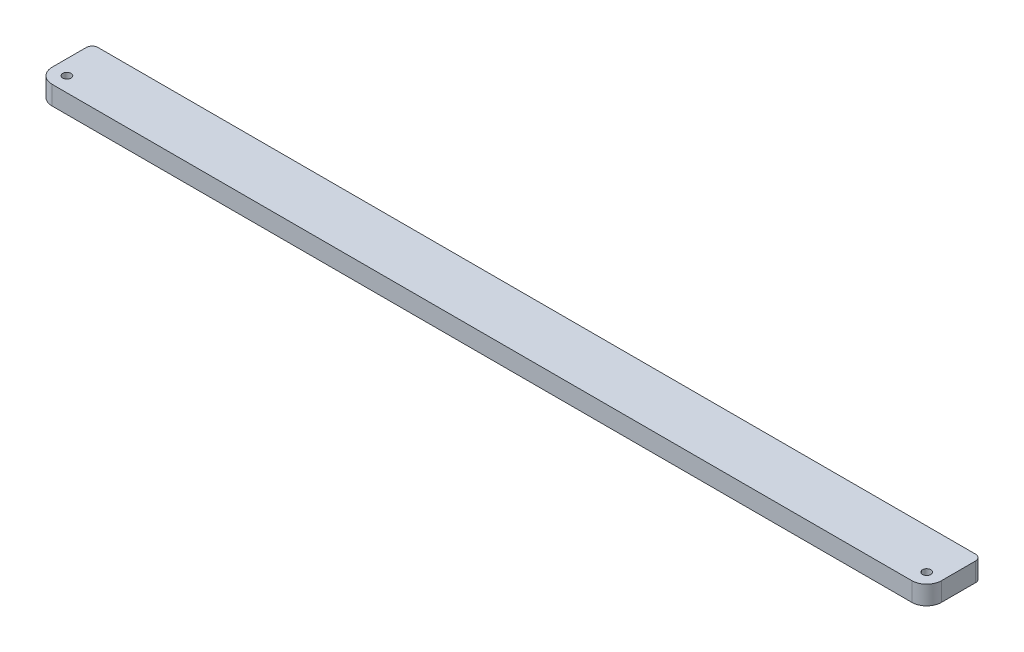
ISO-10303-21;
HEADER;
FILE_DESCRIPTION(('STEP AP214'),'2;1');
FILE_NAME('part.step','',(''),(''),'','','');
FILE_SCHEMA(('AUTOMOTIVE_DESIGN { 1 0 10303 214 1 1 1 1 }'));
ENDSEC;
DATA;
#1=APPLICATION_CONTEXT('core data for automotive mechanical design processes');
#2=APPLICATION_PROTOCOL_DEFINITION('international standard','automotive_design',2000,#1);
#3=PRODUCT_CONTEXT('',#1,'mechanical');
#4=PRODUCT('Part','Part','',(#3));
#5=PRODUCT_RELATED_PRODUCT_CATEGORY('part','',(#4));
#6=PRODUCT_DEFINITION_FORMATION('','',#4);
#7=PRODUCT_DEFINITION_CONTEXT('part definition',#1,'design');
#8=PRODUCT_DEFINITION('design','',#6,#7);
#9=PRODUCT_DEFINITION_SHAPE('','',#8);
#10=(LENGTH_UNIT() NAMED_UNIT(*) SI_UNIT(.MILLI.,.METRE.));
#11=(NAMED_UNIT(*) PLANE_ANGLE_UNIT() SI_UNIT($,.RADIAN.));
#12=(NAMED_UNIT(*) SI_UNIT($,.STERADIAN.) SOLID_ANGLE_UNIT());
#13=UNCERTAINTY_MEASURE_WITH_UNIT(LENGTH_MEASURE(1.E-05),#10,'distance_accuracy_value','');
#14=(GEOMETRIC_REPRESENTATION_CONTEXT(3) GLOBAL_UNCERTAINTY_ASSIGNED_CONTEXT((#13)) GLOBAL_UNIT_ASSIGNED_CONTEXT((#10,
#11,#12)) REPRESENTATION_CONTEXT('',''));
#15=CARTESIAN_POINT('',(0.,0.,0.));
#16=DIRECTION('',(0.,0.,1.));
#17=DIRECTION('',(1.,0.,0.));
#18=AXIS2_PLACEMENT_3D('',#15,#16,#17);
#19=CARTESIAN_POINT('',(-150.,6.35,9.25000000000002));
#20=DIRECTION('',(1.,0.,0.));
#21=DIRECTION('',(0.,0.,-1.));
#22=AXIS2_PLACEMENT_3D('',#19,#20,#21);
#23=PLANE('',#22);
#24=DIRECTION('',(0.,0.,1.));
#25=VECTOR('',#24,1.);
#26=CARTESIAN_POINT('',(-150.,6.35,9.25000000000002));
#27=LINE('',#26,#25);
#28=CARTESIAN_POINT('',(-150.,6.35,-7.24999999999998));
#29=VERTEX_POINT('',#28);
#30=CARTESIAN_POINT('',(-150.,6.35,4.25000000000002));
#31=VERTEX_POINT('',#30);
#32=EDGE_CURVE('E126',#29,#31,#27,.T.);
#33=ORIENTED_EDGE('',*,*,#32,.F.);
#34=DIRECTION('',(0.,-1.,0.));
#35=VECTOR('',#34,1.);
#36=CARTESIAN_POINT('',(-150.,6.35,-7.24999999999998));
#37=LINE('',#36,#35);
#38=CARTESIAN_POINT('',(-150.,0.,-7.24999999999998));
#39=VERTEX_POINT('',#38);
#40=EDGE_CURVE('E152',#29,#39,#37,.T.);
#41=ORIENTED_EDGE('',*,*,#40,.T.);
#42=DIRECTION('',(0.,0.,1.));
#43=VECTOR('',#42,1.);
#44=CARTESIAN_POINT('',(-150.,0.,9.25000000000002));
#45=LINE('',#44,#43);
#46=CARTESIAN_POINT('',(-150.,0.,4.25000000000002));
#47=VERTEX_POINT('',#46);
#48=EDGE_CURVE('E160',#39,#47,#45,.T.);
#49=ORIENTED_EDGE('',*,*,#48,.T.);
#50=DIRECTION('',(0.,-1.,0.));
#51=VECTOR('',#50,1.);
#52=CARTESIAN_POINT('',(-150.,6.35,4.25000000000002));
#53=LINE('',#52,#51);
#54=EDGE_CURVE('E150',#47,#31,#53,.F.);
#55=ORIENTED_EDGE('',*,*,#54,.T.);
#56=EDGE_LOOP('',(#33,#41,#49,#55));
#57=FACE_BOUND('',#56,.T.);
#58=ADVANCED_FACE('F35',(#57),#23,.F.);
#59=CARTESIAN_POINT('',(150.,6.35,9.24999999999998));
#60=DIRECTION('',(0.,0.,-1.));
#61=DIRECTION('',(-1.,0.,0.));
#62=AXIS2_PLACEMENT_3D('',#59,#60,#61);
#63=PLANE('',#62);
#64=DIRECTION('',(1.,0.,0.));
#65=VECTOR('',#64,1.);
#66=CARTESIAN_POINT('',(150.,0.,9.24999999999998));
#67=LINE('',#66,#65);
#68=CARTESIAN_POINT('',(-145.,0.,9.25000000000002));
#69=VERTEX_POINT('',#68);
#70=CARTESIAN_POINT('',(145.,0.,9.24999999999998));
#71=VERTEX_POINT('',#70);
#72=EDGE_CURVE('E131',#69,#71,#67,.T.);
#73=ORIENTED_EDGE('',*,*,#72,.T.);
#74=DIRECTION('',(0.,-1.,0.));
#75=VECTOR('',#74,1.);
#76=CARTESIAN_POINT('',(145.,6.35,9.24999999999998));
#77=LINE('',#76,#75);
#78=CARTESIAN_POINT('',(145.,6.35,9.24999999999998));
#79=VERTEX_POINT('',#78);
#80=EDGE_CURVE('E12',#71,#79,#77,.F.);
#81=ORIENTED_EDGE('',*,*,#80,.T.);
#82=DIRECTION('',(1.,0.,0.));
#83=VECTOR('',#82,1.);
#84=CARTESIAN_POINT('',(150.,6.35,9.24999999999998));
#85=LINE('',#84,#83);
#86=CARTESIAN_POINT('',(-145.,6.35,9.25000000000002));
#87=VERTEX_POINT('',#86);
#88=EDGE_CURVE('E129',#87,#79,#85,.T.);
#89=ORIENTED_EDGE('',*,*,#88,.F.);
#90=DIRECTION('',(0.,-1.,0.));
#91=VECTOR('',#90,1.);
#92=CARTESIAN_POINT('',(-145.,6.35,9.25000000000002));
#93=LINE('',#92,#91);
#94=EDGE_CURVE('E43',#87,#69,#93,.T.);
#95=ORIENTED_EDGE('',*,*,#94,.T.);
#96=EDGE_LOOP('',(#73,#81,#89,#95));
#97=FACE_BOUND('',#96,.T.);
#98=ADVANCED_FACE('F157',(#97),#63,.F.);
#99=CARTESIAN_POINT('',(150.,6.35,9.24999999999998));
#100=DIRECTION('',(-1.,0.,0.));
#101=DIRECTION('',(0.,0.,1.));
#102=AXIS2_PLACEMENT_3D('',#99,#100,#101);
#103=PLANE('',#102);
#104=DIRECTION('',(0.,0.,-1.));
#105=VECTOR('',#104,1.);
#106=CARTESIAN_POINT('',(150.,0.,9.24999999999998));
#107=LINE('',#106,#105);
#108=CARTESIAN_POINT('',(150.,0.,4.24999999999998));
#109=VERTEX_POINT('',#108);
#110=CARTESIAN_POINT('',(150.,0.,-7.25000000000002));
#111=VERTEX_POINT('',#110);
#112=EDGE_CURVE('E127',#109,#111,#107,.T.);
#113=ORIENTED_EDGE('',*,*,#112,.T.);
#114=DIRECTION('',(0.,-1.,0.));
#115=VECTOR('',#114,1.);
#116=CARTESIAN_POINT('',(150.,6.35,-7.25000000000002));
#117=LINE('',#116,#115);
#118=CARTESIAN_POINT('',(150.,6.35,-7.25000000000002));
#119=VERTEX_POINT('',#118);
#120=EDGE_CURVE('E105',#111,#119,#117,.F.);
#121=ORIENTED_EDGE('',*,*,#120,.T.);
#122=DIRECTION('',(0.,0.,-1.));
#123=VECTOR('',#122,1.);
#124=CARTESIAN_POINT('',(150.,6.35,9.24999999999998));
#125=LINE('',#124,#123);
#126=CARTESIAN_POINT('',(150.,6.35,4.24999999999998));
#127=VERTEX_POINT('',#126);
#128=EDGE_CURVE('E165',#127,#119,#125,.T.);
#129=ORIENTED_EDGE('',*,*,#128,.F.);
#130=DIRECTION('',(0.,-1.,0.));
#131=VECTOR('',#130,1.);
#132=CARTESIAN_POINT('',(150.,6.35,4.24999999999998));
#133=LINE('',#132,#131);
#134=EDGE_CURVE('E110',#127,#109,#133,.T.);
#135=ORIENTED_EDGE('',*,*,#134,.T.);
#136=EDGE_LOOP('',(#113,#121,#129,#135));
#137=FACE_BOUND('',#136,.T.);
#138=ADVANCED_FACE('F199',(#137),#103,.F.);
#139=CARTESIAN_POINT('',(150.,6.35,-9.25000000000002));
#140=DIRECTION('',(0.,0.,1.));
#141=DIRECTION('',(1.,0.,0.));
#142=AXIS2_PLACEMENT_3D('',#139,#140,#141);
#143=PLANE('',#142);
#144=DIRECTION('',(-1.,0.,0.));
#145=VECTOR('',#144,1.);
#146=CARTESIAN_POINT('',(150.,6.35,-9.25000000000002));
#147=LINE('',#146,#145);
#148=CARTESIAN_POINT('',(148.,6.35,-9.25000000000002));
#149=VERTEX_POINT('',#148);
#150=CARTESIAN_POINT('',(-148.,6.35,-9.24999999999998));
#151=VERTEX_POINT('',#150);
#152=EDGE_CURVE('E120',#149,#151,#147,.T.);
#153=ORIENTED_EDGE('',*,*,#152,.F.);
#154=DIRECTION('',(0.,-1.,0.));
#155=VECTOR('',#154,1.);
#156=CARTESIAN_POINT('',(148.,6.35,-9.25000000000002));
#157=LINE('',#156,#155);
#158=CARTESIAN_POINT('',(148.,0.,-9.25000000000002));
#159=VERTEX_POINT('',#158);
#160=EDGE_CURVE('E104',#149,#159,#157,.T.);
#161=ORIENTED_EDGE('',*,*,#160,.T.);
#162=DIRECTION('',(-1.,0.,0.));
#163=VECTOR('',#162,1.);
#164=CARTESIAN_POINT('',(150.,0.,-9.25000000000002));
#165=LINE('',#164,#163);
#166=CARTESIAN_POINT('',(-148.,0.,-9.24999999999998));
#167=VERTEX_POINT('',#166);
#168=EDGE_CURVE('E117',#159,#167,#165,.T.);
#169=ORIENTED_EDGE('',*,*,#168,.T.);
#170=DIRECTION('',(0.,-1.,0.));
#171=VECTOR('',#170,1.);
#172=CARTESIAN_POINT('',(-148.,6.35,-9.24999999999998));
#173=LINE('',#172,#171);
#174=EDGE_CURVE('E122',#167,#151,#173,.F.);
#175=ORIENTED_EDGE('',*,*,#174,.T.);
#176=EDGE_LOOP('',(#153,#161,#169,#175));
#177=FACE_BOUND('',#176,.T.);
#178=ADVANCED_FACE('F116',(#177),#143,.F.);
#179=CARTESIAN_POINT('',(0.,6.35,0.));
#180=DIRECTION('',(0.,1.,0.));
#181=DIRECTION('',(0.,0.,1.));
#182=AXIS2_PLACEMENT_3D('',#179,#180,#181);
#183=PLANE('',#182);
#184=CARTESIAN_POINT('',(145.,6.35,4.24999999999998));
#185=DIRECTION('',(0.,1.,0.));
#186=DIRECTION('',(0.,0.,1.));
#187=AXIS2_PLACEMENT_3D('',#184,#185,#186);
#188=CIRCLE('',#187,1.4);
#189=CARTESIAN_POINT('',(145.,6.35,5.64999999999999));
#190=VERTEX_POINT('',#189);
#191=EDGE_CURVE('E175',#190,#190,#188,.T.);
#192=ORIENTED_EDGE('',*,*,#191,.F.);
#193=EDGE_LOOP('',(#192));
#194=FACE_BOUND('',#193,.T.);
#195=CARTESIAN_POINT('',(-145.,6.35,4.25000000000002));
#196=DIRECTION('',(0.,1.,0.));
#197=DIRECTION('',(0.,0.,1.));
#198=AXIS2_PLACEMENT_3D('',#195,#196,#197);
#199=CIRCLE('',#198,1.4);
#200=CARTESIAN_POINT('',(-145.,6.35,5.65000000000002));
#201=VERTEX_POINT('',#200);
#202=EDGE_CURVE('E169',#201,#201,#199,.T.);
#203=ORIENTED_EDGE('',*,*,#202,.F.);
#204=EDGE_LOOP('',(#203));
#205=FACE_BOUND('',#204,.T.);
#206=ORIENTED_EDGE('',*,*,#128,.T.);
#207=CARTESIAN_POINT('',(148.,6.35,-7.25000000000002));
#208=DIRECTION('',(0.,1.,0.));
#209=DIRECTION('',(0.,0.,1.));
#210=AXIS2_PLACEMENT_3D('',#207,#208,#209);
#211=CIRCLE('',#210,2.);
#212=EDGE_CURVE('E148',#119,#149,#211,.T.);
#213=ORIENTED_EDGE('',*,*,#212,.T.);
#214=ORIENTED_EDGE('',*,*,#152,.T.);
#215=CARTESIAN_POINT('',(-148.,6.35,-7.24999999999998));
#216=DIRECTION('',(0.,1.,0.));
#217=DIRECTION('',(0.,0.,1.));
#218=AXIS2_PLACEMENT_3D('',#215,#216,#217);
#219=CIRCLE('',#218,2.);
#220=EDGE_CURVE('E146',#151,#29,#219,.T.);
#221=ORIENTED_EDGE('',*,*,#220,.T.);
#222=ORIENTED_EDGE('',*,*,#32,.T.);
#223=CARTESIAN_POINT('',(-145.,6.35,4.25000000000002));
#224=DIRECTION('',(0.,1.,0.));
#225=DIRECTION('',(0.,0.,1.));
#226=AXIS2_PLACEMENT_3D('',#223,#224,#225);
#227=CIRCLE('',#226,5.);
#228=EDGE_CURVE('E55',#31,#87,#227,.T.);
#229=ORIENTED_EDGE('',*,*,#228,.T.);
#230=ORIENTED_EDGE('',*,*,#88,.T.);
#231=CARTESIAN_POINT('',(145.,6.35,4.24999999999998));
#232=DIRECTION('',(0.,1.,0.));
#233=DIRECTION('',(0.,0.,1.));
#234=AXIS2_PLACEMENT_3D('',#231,#232,#233);
#235=CIRCLE('',#234,5.);
#236=EDGE_CURVE('E144',#79,#127,#235,.T.);
#237=ORIENTED_EDGE('',*,*,#236,.T.);
#238=EDGE_LOOP('',(#206,#213,#214,#221,#222,#229,#230,#237));
#239=FACE_BOUND('',#238,.T.);
#240=ADVANCED_FACE('F190',(#194,#205,#239),#183,.T.);
#241=CARTESIAN_POINT('',(0.,0.,0.));
#242=DIRECTION('',(0.,1.,0.));
#243=DIRECTION('',(0.,0.,1.));
#244=AXIS2_PLACEMENT_3D('',#241,#242,#243);
#245=PLANE('',#244);
#246=CARTESIAN_POINT('',(145.,0.,4.24999999999998));
#247=DIRECTION('',(0.,1.,0.));
#248=DIRECTION('',(0.,0.,1.));
#249=AXIS2_PLACEMENT_3D('',#246,#247,#248);
#250=CIRCLE('',#249,1.4);
#251=CARTESIAN_POINT('',(145.,0.,5.64999999999999));
#252=VERTEX_POINT('',#251);
#253=EDGE_CURVE('E172',#252,#252,#250,.T.);
#254=ORIENTED_EDGE('',*,*,#253,.T.);
#255=EDGE_LOOP('',(#254));
#256=FACE_BOUND('',#255,.T.);
#257=CARTESIAN_POINT('',(-145.,0.,4.25000000000002));
#258=DIRECTION('',(0.,1.,0.));
#259=DIRECTION('',(0.,0.,1.));
#260=AXIS2_PLACEMENT_3D('',#257,#258,#259);
#261=CIRCLE('',#260,1.4);
#262=CARTESIAN_POINT('',(-145.,0.,5.65000000000002));
#263=VERTEX_POINT('',#262);
#264=EDGE_CURVE('E161',#263,#263,#261,.T.);
#265=ORIENTED_EDGE('',*,*,#264,.T.);
#266=EDGE_LOOP('',(#265));
#267=FACE_BOUND('',#266,.T.);
#268=ORIENTED_EDGE('',*,*,#168,.F.);
#269=CARTESIAN_POINT('',(148.,0.,-7.25000000000002));
#270=DIRECTION('',(0.,1.,0.));
#271=DIRECTION('',(0.,0.,1.));
#272=AXIS2_PLACEMENT_3D('',#269,#270,#271);
#273=CIRCLE('',#272,2.);
#274=EDGE_CURVE('E100',#159,#111,#273,.F.);
#275=ORIENTED_EDGE('',*,*,#274,.T.);
#276=ORIENTED_EDGE('',*,*,#112,.F.);
#277=CARTESIAN_POINT('',(145.,0.,4.24999999999998));
#278=DIRECTION('',(0.,1.,0.));
#279=DIRECTION('',(0.,0.,1.));
#280=AXIS2_PLACEMENT_3D('',#277,#278,#279);
#281=CIRCLE('',#280,5.);
#282=EDGE_CURVE('E137',#109,#71,#281,.F.);
#283=ORIENTED_EDGE('',*,*,#282,.T.);
#284=ORIENTED_EDGE('',*,*,#72,.F.);
#285=CARTESIAN_POINT('',(-145.,0.,4.25000000000002));
#286=DIRECTION('',(0.,1.,0.));
#287=DIRECTION('',(0.,0.,1.));
#288=AXIS2_PLACEMENT_3D('',#285,#286,#287);
#289=CIRCLE('',#288,5.);
#290=EDGE_CURVE('E121',#69,#47,#289,.F.);
#291=ORIENTED_EDGE('',*,*,#290,.T.);
#292=ORIENTED_EDGE('',*,*,#48,.F.);
#293=CARTESIAN_POINT('',(-148.,0.,-7.24999999999998));
#294=DIRECTION('',(0.,1.,0.));
#295=DIRECTION('',(0.,0.,1.));
#296=AXIS2_PLACEMENT_3D('',#293,#294,#295);
#297=CIRCLE('',#296,2.);
#298=EDGE_CURVE('E111',#39,#167,#297,.F.);
#299=ORIENTED_EDGE('',*,*,#298,.T.);
#300=EDGE_LOOP('',(#268,#275,#276,#283,#284,#291,#292,#299));
#301=FACE_BOUND('',#300,.T.);
#302=ADVANCED_FACE('F124',(#256,#267,#301),#245,.F.);
#303=CARTESIAN_POINT('',(148.,6.35,-7.25000000000002));
#304=DIRECTION('',(0.,-1.,0.));
#305=DIRECTION('',(0.,0.,-1.));
#306=AXIS2_PLACEMENT_3D('',#303,#304,#305);
#307=CYLINDRICAL_SURFACE('',#306,2.);
#308=ORIENTED_EDGE('',*,*,#212,.F.);
#309=ORIENTED_EDGE('',*,*,#120,.F.);
#310=ORIENTED_EDGE('',*,*,#274,.F.);
#311=ORIENTED_EDGE('',*,*,#160,.F.);
#312=EDGE_LOOP('',(#308,#309,#310,#311));
#313=FACE_BOUND('',#312,.T.);
#314=ADVANCED_FACE('F103',(#313),#307,.T.);
#315=CARTESIAN_POINT('',(-148.,6.35,-7.24999999999998));
#316=DIRECTION('',(0.,-1.,0.));
#317=DIRECTION('',(0.,0.,-1.));
#318=AXIS2_PLACEMENT_3D('',#315,#316,#317);
#319=CYLINDRICAL_SURFACE('',#318,2.);
#320=ORIENTED_EDGE('',*,*,#220,.F.);
#321=ORIENTED_EDGE('',*,*,#174,.F.);
#322=ORIENTED_EDGE('',*,*,#298,.F.);
#323=ORIENTED_EDGE('',*,*,#40,.F.);
#324=EDGE_LOOP('',(#320,#321,#322,#323));
#325=FACE_BOUND('',#324,.T.);
#326=ADVANCED_FACE('F203',(#325),#319,.T.);
#327=CARTESIAN_POINT('',(145.,6.35,4.24999999999998));
#328=DIRECTION('',(0.,-1.,0.));
#329=DIRECTION('',(0.,0.,-1.));
#330=AXIS2_PLACEMENT_3D('',#327,#328,#329);
#331=CYLINDRICAL_SURFACE('',#330,5.);
#332=ORIENTED_EDGE('',*,*,#236,.F.);
#333=ORIENTED_EDGE('',*,*,#80,.F.);
#334=ORIENTED_EDGE('',*,*,#282,.F.);
#335=ORIENTED_EDGE('',*,*,#134,.F.);
#336=EDGE_LOOP('',(#332,#333,#334,#335));
#337=FACE_BOUND('',#336,.T.);
#338=ADVANCED_FACE('F201',(#337),#331,.T.);
#339=CARTESIAN_POINT('',(-145.,6.35,4.25000000000002));
#340=DIRECTION('',(0.,-1.,0.));
#341=DIRECTION('',(0.,0.,-1.));
#342=AXIS2_PLACEMENT_3D('',#339,#340,#341);
#343=CYLINDRICAL_SURFACE('',#342,5.);
#344=ORIENTED_EDGE('',*,*,#228,.F.);
#345=ORIENTED_EDGE('',*,*,#54,.F.);
#346=ORIENTED_EDGE('',*,*,#290,.F.);
#347=ORIENTED_EDGE('',*,*,#94,.F.);
#348=EDGE_LOOP('',(#344,#345,#346,#347));
#349=FACE_BOUND('',#348,.T.);
#350=ADVANCED_FACE('F37',(#349),#343,.T.);
#351=CARTESIAN_POINT('',(-145.,0.,4.25000000000002));
#352=DIRECTION('',(0.,1.,0.));
#353=DIRECTION('',(0.,0.,1.));
#354=AXIS2_PLACEMENT_3D('',#351,#352,#353);
#355=CYLINDRICAL_SURFACE('',#354,1.4);
#356=ORIENTED_EDGE('',*,*,#264,.F.);
#357=EDGE_LOOP('',(#356));
#358=FACE_BOUND('',#357,.T.);
#359=ORIENTED_EDGE('',*,*,#202,.T.);
#360=EDGE_LOOP('',(#359));
#361=FACE_BOUND('',#360,.T.);
#362=ADVANCED_FACE('F186',(#358,#361),#355,.F.);
#363=CARTESIAN_POINT('',(145.,0.,4.24999999999998));
#364=DIRECTION('',(0.,1.,0.));
#365=DIRECTION('',(0.,0.,1.));
#366=AXIS2_PLACEMENT_3D('',#363,#364,#365);
#367=CYLINDRICAL_SURFACE('',#366,1.4);
#368=ORIENTED_EDGE('',*,*,#253,.F.);
#369=EDGE_LOOP('',(#368));
#370=FACE_BOUND('',#369,.T.);
#371=ORIENTED_EDGE('',*,*,#191,.T.);
#372=EDGE_LOOP('',(#371));
#373=FACE_BOUND('',#372,.T.);
#374=ADVANCED_FACE('F183',(#370,#373),#367,.F.);
#375=CLOSED_SHELL('',(#58,#98,#138,#178,#240,#302,#314,#326,#338,#350,#362,#374));
#376=MANIFOLD_SOLID_BREP('B2',#375);
#377=ADVANCED_BREP_SHAPE_REPRESENTATION('',(#18,#376),#14);
#378=SHAPE_DEFINITION_REPRESENTATION(#9,#377);
ENDSEC;
END-ISO-10303-21;
